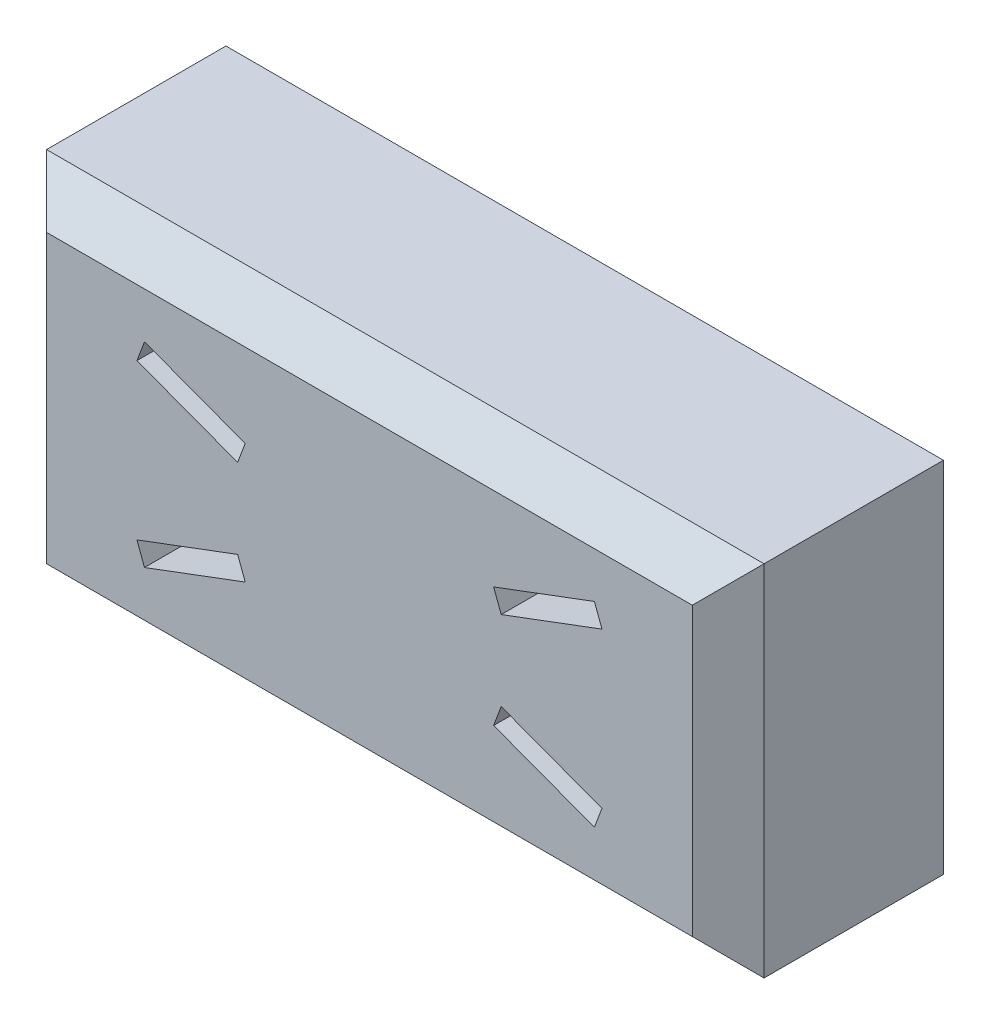
ISO-10303-21;
HEADER;
FILE_DESCRIPTION(('STEP AP214'),'2;1');
FILE_NAME('part.step','',(''),(''),'','','');
FILE_SCHEMA(('AUTOMOTIVE_DESIGN { 1 0 10303 214 1 1 1 1 }'));
ENDSEC;
DATA;
#1=APPLICATION_CONTEXT('core data for automotive mechanical design processes');
#2=APPLICATION_PROTOCOL_DEFINITION('international standard','automotive_design',2000,#1);
#3=PRODUCT_CONTEXT('',#1,'mechanical');
#4=PRODUCT('Part','Part','',(#3));
#5=PRODUCT_RELATED_PRODUCT_CATEGORY('part','',(#4));
#6=PRODUCT_DEFINITION_FORMATION('','',#4);
#7=PRODUCT_DEFINITION_CONTEXT('part definition',#1,'design');
#8=PRODUCT_DEFINITION('design','',#6,#7);
#9=PRODUCT_DEFINITION_SHAPE('','',#8);
#10=(LENGTH_UNIT() NAMED_UNIT(*) SI_UNIT(.MILLI.,.METRE.));
#11=(NAMED_UNIT(*) PLANE_ANGLE_UNIT() SI_UNIT($,.RADIAN.));
#12=(NAMED_UNIT(*) SI_UNIT($,.STERADIAN.) SOLID_ANGLE_UNIT());
#13=UNCERTAINTY_MEASURE_WITH_UNIT(LENGTH_MEASURE(1.E-05),#10,'distance_accuracy_value','');
#14=(GEOMETRIC_REPRESENTATION_CONTEXT(3) GLOBAL_UNCERTAINTY_ASSIGNED_CONTEXT((#13)) GLOBAL_UNIT_ASSIGNED_CONTEXT((#10,
#11,#12)) REPRESENTATION_CONTEXT('',''));
#15=CARTESIAN_POINT('',(0.,0.,0.));
#16=DIRECTION('',(0.,0.,1.));
#17=DIRECTION('',(1.,0.,0.));
#18=AXIS2_PLACEMENT_3D('',#15,#16,#17);
#19=CARTESIAN_POINT('',(5.,-2.5,3.));
#20=DIRECTION('',(-1.,0.,0.));
#21=DIRECTION('',(0.,0.,1.));
#22=AXIS2_PLACEMENT_3D('',#19,#20,#21);
#23=PLANE('',#22);
#24=DIRECTION('',(0.,0.,-1.));
#25=VECTOR('',#24,1.);
#26=CARTESIAN_POINT('',(5.,2.5,3.));
#27=LINE('',#26,#25);
#28=CARTESIAN_POINT('',(5.,2.5,2.5));
#29=VERTEX_POINT('',#28);
#30=CARTESIAN_POINT('',(5.,2.5,0.));
#31=VERTEX_POINT('',#30);
#32=EDGE_CURVE('E340',#29,#31,#27,.T.);
#33=ORIENTED_EDGE('',*,*,#32,.F.);
#34=DIRECTION('',(0.,-1.,0.));
#35=VECTOR('',#34,1.);
#36=CARTESIAN_POINT('',(5.,-2.5,2.5));
#37=LINE('',#36,#35);
#38=CARTESIAN_POINT('',(5.,-2.5,2.5));
#39=VERTEX_POINT('',#38);
#40=EDGE_CURVE('E11',#29,#39,#37,.T.);
#41=ORIENTED_EDGE('',*,*,#40,.T.);
#42=DIRECTION('',(0.,0.,-1.));
#43=VECTOR('',#42,1.);
#44=CARTESIAN_POINT('',(5.,-2.5,3.));
#45=LINE('',#44,#43);
#46=CARTESIAN_POINT('',(5.,-2.5,0.));
#47=VERTEX_POINT('',#46);
#48=EDGE_CURVE('E334',#39,#47,#45,.T.);
#49=ORIENTED_EDGE('',*,*,#48,.T.);
#50=DIRECTION('',(0.,1.,0.));
#51=VECTOR('',#50,1.);
#52=CARTESIAN_POINT('',(5.,-2.5,0.));
#53=LINE('',#52,#51);
#54=EDGE_CURVE('E322',#47,#31,#53,.T.);
#55=ORIENTED_EDGE('',*,*,#54,.T.);
#56=EDGE_LOOP('',(#33,#41,#49,#55));
#57=FACE_BOUND('',#56,.T.);
#58=ADVANCED_FACE('F39',(#57),#23,.F.);
#59=CARTESIAN_POINT('',(-5.,2.5,3.));
#60=DIRECTION('',(0.,-1.,0.));
#61=DIRECTION('',(0.,0.,-1.));
#62=AXIS2_PLACEMENT_3D('',#59,#60,#61);
#63=PLANE('',#62);
#64=DIRECTION('',(0.,0.,-1.));
#65=VECTOR('',#64,1.);
#66=CARTESIAN_POINT('',(-5.,2.5,3.));
#67=LINE('',#66,#65);
#68=CARTESIAN_POINT('',(-5.,2.5,2.5));
#69=VERTEX_POINT('',#68);
#70=CARTESIAN_POINT('',(-5.,2.5,0.));
#71=VERTEX_POINT('',#70);
#72=EDGE_CURVE('E338',#69,#71,#67,.T.);
#73=ORIENTED_EDGE('',*,*,#72,.F.);
#74=DIRECTION('',(1.,0.,0.));
#75=VECTOR('',#74,1.);
#76=CARTESIAN_POINT('',(-5.,2.5,2.5));
#77=LINE('',#76,#75);
#78=EDGE_CURVE('E49',#69,#29,#77,.T.);
#79=ORIENTED_EDGE('',*,*,#78,.T.);
#80=ORIENTED_EDGE('',*,*,#32,.T.);
#81=DIRECTION('',(-1.,0.,0.));
#82=VECTOR('',#81,1.);
#83=CARTESIAN_POINT('',(-5.,2.5,0.));
#84=LINE('',#83,#82);
#85=EDGE_CURVE('E325',#31,#71,#84,.T.);
#86=ORIENTED_EDGE('',*,*,#85,.T.);
#87=EDGE_LOOP('',(#73,#79,#80,#86));
#88=FACE_BOUND('',#87,.T.);
#89=ADVANCED_FACE('F378',(#88),#63,.F.);
#90=CARTESIAN_POINT('',(-5.,-2.5,3.));
#91=DIRECTION('',(1.,0.,0.));
#92=DIRECTION('',(0.,0.,-1.));
#93=AXIS2_PLACEMENT_3D('',#90,#91,#92);
#94=PLANE('',#93);
#95=DIRECTION('',(0.,0.,-1.));
#96=VECTOR('',#95,1.);
#97=CARTESIAN_POINT('',(-5.,-2.5,3.));
#98=LINE('',#97,#96);
#99=CARTESIAN_POINT('',(-5.,-2.5,2.5));
#100=VERTEX_POINT('',#99);
#101=CARTESIAN_POINT('',(-5.,-2.5,0.));
#102=VERTEX_POINT('',#101);
#103=EDGE_CURVE('E336',#100,#102,#98,.T.);
#104=ORIENTED_EDGE('',*,*,#103,.F.);
#105=DIRECTION('',(0.,1.,0.));
#106=VECTOR('',#105,1.);
#107=CARTESIAN_POINT('',(-5.,-2.5,2.5));
#108=LINE('',#107,#106);
#109=EDGE_CURVE('E354',#100,#69,#108,.T.);
#110=ORIENTED_EDGE('',*,*,#109,.T.);
#111=ORIENTED_EDGE('',*,*,#72,.T.);
#112=DIRECTION('',(0.,-1.,0.));
#113=VECTOR('',#112,1.);
#114=CARTESIAN_POINT('',(-5.,-2.5,0.));
#115=LINE('',#114,#113);
#116=EDGE_CURVE('E328',#71,#102,#115,.T.);
#117=ORIENTED_EDGE('',*,*,#116,.T.);
#118=EDGE_LOOP('',(#104,#110,#111,#117));
#119=FACE_BOUND('',#118,.T.);
#120=ADVANCED_FACE('F389',(#119),#94,.F.);
#121=CARTESIAN_POINT('',(-5.,-2.5,3.));
#122=DIRECTION('',(0.,1.,0.));
#123=DIRECTION('',(0.,0.,1.));
#124=AXIS2_PLACEMENT_3D('',#121,#122,#123);
#125=PLANE('',#124);
#126=ORIENTED_EDGE('',*,*,#48,.F.);
#127=DIRECTION('',(-1.,0.,0.));
#128=VECTOR('',#127,1.);
#129=CARTESIAN_POINT('',(-5.,-2.5,2.5));
#130=LINE('',#129,#128);
#131=EDGE_CURVE('E351',#39,#100,#130,.T.);
#132=ORIENTED_EDGE('',*,*,#131,.T.);
#133=ORIENTED_EDGE('',*,*,#103,.T.);
#134=DIRECTION('',(1.,0.,0.));
#135=VECTOR('',#134,1.);
#136=CARTESIAN_POINT('',(-5.,-2.5,0.));
#137=LINE('',#136,#135);
#138=EDGE_CURVE('E331',#102,#47,#137,.T.);
#139=ORIENTED_EDGE('',*,*,#138,.T.);
#140=EDGE_LOOP('',(#126,#132,#133,#139));
#141=FACE_BOUND('',#140,.T.);
#142=ADVANCED_FACE('F391',(#141),#125,.F.);
#143=CARTESIAN_POINT('',(0.,0.,3.));
#144=DIRECTION('',(0.,0.,-1.));
#145=DIRECTION('',(-1.,0.,0.));
#146=AXIS2_PLACEMENT_3D('',#143,#144,#145);
#147=PLANE('',#146);
#148=DIRECTION('',(0.936329177569044,-0.351123441588393,0.));
#149=VECTOR('',#148,1.);
#150=CARTESIAN_POINT('',(1.73117295913665,-0.83618753526527,3.));
#151=LINE('',#150,#149);
#152=CARTESIAN_POINT('',(1.73117295913665,-0.83618753526527,3.));
#153=VERTEX_POINT('',#152);
#154=CARTESIAN_POINT('',(3.13566672549021,-1.36287269764786,3.));
#155=VERTEX_POINT('',#154);
#156=EDGE_CURVE('E248',#153,#155,#151,.T.);
#157=ORIENTED_EDGE('',*,*,#156,.F.);
#158=DIRECTION('',(-0.351123441588394,-0.936329177569044,0.));
#159=VECTOR('',#158,1.);
#160=CARTESIAN_POINT('',(1.73117295913665,-0.83618753526527,3.));
#161=LINE('',#160,#159);
#162=CARTESIAN_POINT('',(1.83650999161316,-0.555288781994558,3.));
#163=VERTEX_POINT('',#162);
#164=EDGE_CURVE('E57',#163,#153,#161,.T.);
#165=ORIENTED_EDGE('',*,*,#164,.F.);
#166=DIRECTION('',(-0.936329177569045,0.351123441588392,0.));
#167=VECTOR('',#166,1.);
#168=CARTESIAN_POINT('',(1.83650999161316,-0.555288781994558,3.));
#169=LINE('',#168,#167);
#170=CARTESIAN_POINT('',(3.24100375796673,-1.08197394437715,3.));
#171=VERTEX_POINT('',#170);
#172=EDGE_CURVE('E241',#171,#163,#169,.T.);
#173=ORIENTED_EDGE('',*,*,#172,.F.);
#174=DIRECTION('',(0.351123441588392,0.936329177569044,0.));
#175=VECTOR('',#174,1.);
#176=CARTESIAN_POINT('',(3.24100375796673,-1.08197394437715,3.));
#177=LINE('',#176,#175);
#178=EDGE_CURVE('E244',#155,#171,#177,.T.);
#179=ORIENTED_EDGE('',*,*,#178,.F.);
#180=EDGE_LOOP('',(#157,#165,#173,#179));
#181=FACE_BOUND('',#180,.T.);
#182=DIRECTION('',(-0.936329177569044,0.351123441588393,0.));
#183=VECTOR('',#182,1.);
#184=CARTESIAN_POINT('',(-1.73117295913665,0.83618753526527,3.));
#185=LINE('',#184,#183);
#186=CARTESIAN_POINT('',(-1.73117295913665,0.83618753526527,3.));
#187=VERTEX_POINT('',#186);
#188=CARTESIAN_POINT('',(-3.13566672549021,1.36287269764786,3.));
#189=VERTEX_POINT('',#188);
#190=EDGE_CURVE('E276',#187,#189,#185,.T.);
#191=ORIENTED_EDGE('',*,*,#190,.F.);
#192=DIRECTION('',(0.351123441588394,0.936329177569044,0.));
#193=VECTOR('',#192,1.);
#194=CARTESIAN_POINT('',(-1.73117295913665,0.83618753526527,3.));
#195=LINE('',#194,#193);
#196=CARTESIAN_POINT('',(-1.83650999161316,0.555288781994558,3.));
#197=VERTEX_POINT('',#196);
#198=EDGE_CURVE('E65',#197,#187,#195,.T.);
#199=ORIENTED_EDGE('',*,*,#198,.F.);
#200=DIRECTION('',(0.936329177569045,-0.351123441588392,0.));
#201=VECTOR('',#200,1.);
#202=CARTESIAN_POINT('',(-1.83650999161316,0.555288781994558,3.));
#203=LINE('',#202,#201);
#204=CARTESIAN_POINT('',(-3.24100375796673,1.08197394437715,3.));
#205=VERTEX_POINT('',#204);
#206=EDGE_CURVE('E269',#205,#197,#203,.T.);
#207=ORIENTED_EDGE('',*,*,#206,.F.);
#208=DIRECTION('',(-0.351123441588392,-0.936329177569044,0.));
#209=VECTOR('',#208,1.);
#210=CARTESIAN_POINT('',(-3.24100375796673,1.08197394437715,3.));
#211=LINE('',#210,#209);
#212=EDGE_CURVE('E272',#189,#205,#211,.T.);
#213=ORIENTED_EDGE('',*,*,#212,.F.);
#214=EDGE_LOOP('',(#191,#199,#207,#213));
#215=FACE_BOUND('',#214,.T.);
#216=DIRECTION('',(-0.351123441588394,0.936329177569044,0.));
#217=VECTOR('',#216,1.);
#218=CARTESIAN_POINT('',(-1.73117295913665,-0.83618753526527,3.));
#219=LINE('',#218,#217);
#220=CARTESIAN_POINT('',(-1.73117295913665,-0.83618753526527,3.));
#221=VERTEX_POINT('',#220);
#222=CARTESIAN_POINT('',(-1.83650999161316,-0.555288781994558,3.));
#223=VERTEX_POINT('',#222);
#224=EDGE_CURVE('E214',#221,#223,#219,.T.);
#225=ORIENTED_EDGE('',*,*,#224,.F.);
#226=DIRECTION('',(0.936329177569044,0.351123441588393,0.));
#227=VECTOR('',#226,1.);
#228=CARTESIAN_POINT('',(-1.73117295913665,-0.83618753526527,3.));
#229=LINE('',#228,#227);
#230=CARTESIAN_POINT('',(-3.13566672549021,-1.36287269764786,3.));
#231=VERTEX_POINT('',#230);
#232=EDGE_CURVE('E193',#231,#221,#229,.T.);
#233=ORIENTED_EDGE('',*,*,#232,.F.);
#234=DIRECTION('',(0.351123441588392,-0.936329177569044,0.));
#235=VECTOR('',#234,1.);
#236=CARTESIAN_POINT('',(-3.24100375796673,-1.08197394437715,3.));
#237=LINE('',#236,#235);
#238=CARTESIAN_POINT('',(-3.24100375796673,-1.08197394437715,3.));
#239=VERTEX_POINT('',#238);
#240=EDGE_CURVE('E203',#239,#231,#237,.T.);
#241=ORIENTED_EDGE('',*,*,#240,.F.);
#242=DIRECTION('',(-0.936329177569045,-0.351123441588392,0.));
#243=VECTOR('',#242,1.);
#244=CARTESIAN_POINT('',(-1.83650999161316,-0.555288781994558,3.));
#245=LINE('',#244,#243);
#246=EDGE_CURVE('E208',#223,#239,#245,.T.);
#247=ORIENTED_EDGE('',*,*,#246,.F.);
#248=EDGE_LOOP('',(#225,#233,#241,#247));
#249=FACE_BOUND('',#248,.T.);
#250=DIRECTION('',(0.351123441588394,-0.936329177569044,0.));
#251=VECTOR('',#250,1.);
#252=CARTESIAN_POINT('',(1.73117295913665,0.83618753526527,3.));
#253=LINE('',#252,#251);
#254=CARTESIAN_POINT('',(1.73117295913665,0.83618753526527,3.));
#255=VERTEX_POINT('',#254);
#256=CARTESIAN_POINT('',(1.83650999161316,0.555288781994558,3.));
#257=VERTEX_POINT('',#256);
#258=EDGE_CURVE('E305',#255,#257,#253,.T.);
#259=ORIENTED_EDGE('',*,*,#258,.F.);
#260=DIRECTION('',(-0.936329177569044,-0.351123441588393,0.));
#261=VECTOR('',#260,1.);
#262=CARTESIAN_POINT('',(1.73117295913665,0.83618753526527,3.));
#263=LINE('',#262,#261);
#264=CARTESIAN_POINT('',(3.13566672549021,1.36287269764786,3.));
#265=VERTEX_POINT('',#264);
#266=EDGE_CURVE('E252',#265,#255,#263,.T.);
#267=ORIENTED_EDGE('',*,*,#266,.F.);
#268=DIRECTION('',(-0.351123441588392,0.936329177569044,0.));
#269=VECTOR('',#268,1.);
#270=CARTESIAN_POINT('',(3.24100375796673,1.08197394437715,3.));
#271=LINE('',#270,#269);
#272=CARTESIAN_POINT('',(3.24100375796673,1.08197394437715,3.));
#273=VERTEX_POINT('',#272);
#274=EDGE_CURVE('E294',#273,#265,#271,.T.);
#275=ORIENTED_EDGE('',*,*,#274,.F.);
#276=DIRECTION('',(0.936329177569045,0.351123441588392,0.));
#277=VECTOR('',#276,1.);
#278=CARTESIAN_POINT('',(1.83650999161316,0.555288781994558,3.));
#279=LINE('',#278,#277);
#280=EDGE_CURVE('E308',#257,#273,#279,.T.);
#281=ORIENTED_EDGE('',*,*,#280,.F.);
#282=EDGE_LOOP('',(#259,#267,#275,#281));
#283=FACE_BOUND('',#282,.T.);
#284=DIRECTION('',(0.,-1.,0.));
#285=VECTOR('',#284,1.);
#286=CARTESIAN_POINT('',(-4.5,0.,3.));
#287=LINE('',#286,#285);
#288=CARTESIAN_POINT('',(-4.5,2.,3.));
#289=VERTEX_POINT('',#288);
#290=CARTESIAN_POINT('',(-4.5,-2.,3.));
#291=VERTEX_POINT('',#290);
#292=EDGE_CURVE('E346',#289,#291,#287,.T.);
#293=ORIENTED_EDGE('',*,*,#292,.T.);
#294=DIRECTION('',(1.,0.,0.));
#295=VECTOR('',#294,1.);
#296=CARTESIAN_POINT('',(0.,-2.,3.));
#297=LINE('',#296,#295);
#298=CARTESIAN_POINT('',(4.5,-2.,3.));
#299=VERTEX_POINT('',#298);
#300=EDGE_CURVE('E348',#291,#299,#297,.T.);
#301=ORIENTED_EDGE('',*,*,#300,.T.);
#302=DIRECTION('',(0.,1.,0.));
#303=VECTOR('',#302,1.);
#304=CARTESIAN_POINT('',(4.5,0.,3.));
#305=LINE('',#304,#303);
#306=CARTESIAN_POINT('',(4.5,2.,3.));
#307=VERTEX_POINT('',#306);
#308=EDGE_CURVE('E342',#299,#307,#305,.T.);
#309=ORIENTED_EDGE('',*,*,#308,.T.);
#310=DIRECTION('',(-1.,0.,0.));
#311=VECTOR('',#310,1.);
#312=CARTESIAN_POINT('',(0.,2.,3.));
#313=LINE('',#312,#311);
#314=EDGE_CURVE('E344',#307,#289,#313,.T.);
#315=ORIENTED_EDGE('',*,*,#314,.T.);
#316=EDGE_LOOP('',(#293,#301,#309,#315));
#317=FACE_BOUND('',#316,.T.);
#318=ADVANCED_FACE('F211',(#181,#215,#249,#283,#317),#147,.F.);
#319=CARTESIAN_POINT('',(0.,0.,0.));
#320=DIRECTION('',(0.,0.,-1.));
#321=DIRECTION('',(-1.,0.,0.));
#322=AXIS2_PLACEMENT_3D('',#319,#320,#321);
#323=PLANE('',#322);
#324=ORIENTED_EDGE('',*,*,#54,.F.);
#325=ORIENTED_EDGE('',*,*,#138,.F.);
#326=ORIENTED_EDGE('',*,*,#116,.F.);
#327=ORIENTED_EDGE('',*,*,#85,.F.);
#328=EDGE_LOOP('',(#324,#325,#326,#327));
#329=FACE_BOUND('',#328,.T.);
#330=ADVANCED_FACE('F385',(#329),#323,.T.);
#331=CARTESIAN_POINT('',(0.,2.,3.));
#332=DIRECTION('',(0.,-0.707106781186549,-0.707106781186546));
#333=DIRECTION('',(-1.,0.,0.));
#334=AXIS2_PLACEMENT_3D('',#331,#332,#333);
#335=PLANE('',#334);
#336=DIRECTION('',(-0.577350269189625,-0.577350269189625,0.577350269189627));
#337=VECTOR('',#336,1.);
#338=CARTESIAN_POINT('',(3.83333333333333,1.33333333333333,3.66666666666667));
#339=LINE('',#338,#337);
#340=EDGE_CURVE('E359',#29,#307,#339,.T.);
#341=ORIENTED_EDGE('',*,*,#340,.F.);
#342=ORIENTED_EDGE('',*,*,#78,.F.);
#343=DIRECTION('',(0.577350269189625,-0.577350269189625,0.577350269189627));
#344=VECTOR('',#343,1.);
#345=CARTESIAN_POINT('',(-3.,0.500000000000002,4.5));
#346=LINE('',#345,#344);
#347=EDGE_CURVE('E44',#289,#69,#346,.F.);
#348=ORIENTED_EDGE('',*,*,#347,.F.);
#349=ORIENTED_EDGE('',*,*,#314,.F.);
#350=EDGE_LOOP('',(#341,#342,#348,#349));
#351=FACE_BOUND('',#350,.T.);
#352=ADVANCED_FACE('F42',(#351),#335,.F.);
#353=CARTESIAN_POINT('',(-4.5,0.,3.));
#354=DIRECTION('',(0.707106781186549,0.,-0.707106781186546));
#355=DIRECTION('',(0.,-1.,0.));
#356=AXIS2_PLACEMENT_3D('',#353,#354,#355);
#357=PLANE('',#356);
#358=ORIENTED_EDGE('',*,*,#347,.T.);
#359=ORIENTED_EDGE('',*,*,#109,.F.);
#360=DIRECTION('',(0.577350269189625,0.577350269189625,0.577350269189627));
#361=VECTOR('',#360,1.);
#362=CARTESIAN_POINT('',(-3.83333333333333,-1.33333333333333,3.66666666666667));
#363=LINE('',#362,#361);
#364=EDGE_CURVE('E358',#291,#100,#363,.F.);
#365=ORIENTED_EDGE('',*,*,#364,.F.);
#366=ORIENTED_EDGE('',*,*,#292,.F.);
#367=EDGE_LOOP('',(#358,#359,#365,#366));
#368=FACE_BOUND('',#367,.T.);
#369=ADVANCED_FACE('F370',(#368),#357,.F.);
#370=CARTESIAN_POINT('',(4.5,0.,3.));
#371=DIRECTION('',(-0.707106781186549,0.,-0.707106781186546));
#372=DIRECTION('',(0.,1.,0.));
#373=AXIS2_PLACEMENT_3D('',#370,#371,#372);
#374=PLANE('',#373);
#375=ORIENTED_EDGE('',*,*,#340,.T.);
#376=ORIENTED_EDGE('',*,*,#308,.F.);
#377=DIRECTION('',(0.577350269189625,-0.577350269189625,-0.577350269189627));
#378=VECTOR('',#377,1.);
#379=CARTESIAN_POINT('',(3.83333333333333,-1.33333333333333,3.66666666666667));
#380=LINE('',#379,#378);
#381=EDGE_CURVE('E315',#39,#299,#380,.F.);
#382=ORIENTED_EDGE('',*,*,#381,.F.);
#383=ORIENTED_EDGE('',*,*,#40,.F.);
#384=EDGE_LOOP('',(#375,#376,#382,#383));
#385=FACE_BOUND('',#384,.T.);
#386=ADVANCED_FACE('F397',(#385),#374,.F.);
#387=CARTESIAN_POINT('',(0.,-2.,3.));
#388=DIRECTION('',(0.,0.707106781186549,-0.707106781186546));
#389=DIRECTION('',(1.,0.,0.));
#390=AXIS2_PLACEMENT_3D('',#387,#388,#389);
#391=PLANE('',#390);
#392=ORIENTED_EDGE('',*,*,#364,.T.);
#393=ORIENTED_EDGE('',*,*,#131,.F.);
#394=ORIENTED_EDGE('',*,*,#381,.T.);
#395=ORIENTED_EDGE('',*,*,#300,.F.);
#396=EDGE_LOOP('',(#392,#393,#394,#395));
#397=FACE_BOUND('',#396,.T.);
#398=ADVANCED_FACE('F395',(#397),#391,.F.);
#399=CARTESIAN_POINT('',(1.73117295913665,0.83618753526527,2.));
#400=DIRECTION('',(-0.351123441588393,0.936329177569044,0.));
#401=DIRECTION('',(-0.936329177569044,-0.351123441588393,0.));
#402=AXIS2_PLACEMENT_3D('',#399,#400,#401);
#403=PLANE('',#402);
#404=ORIENTED_EDGE('',*,*,#266,.T.);
#405=DIRECTION('',(0.,0.,1.));
#406=VECTOR('',#405,1.);
#407=CARTESIAN_POINT('',(1.73117295913665,0.83618753526527,2.));
#408=LINE('',#407,#406);
#409=CARTESIAN_POINT('',(1.73117295913665,0.83618753526527,2.));
#410=VERTEX_POINT('',#409);
#411=EDGE_CURVE('E303',#410,#255,#408,.T.);
#412=ORIENTED_EDGE('',*,*,#411,.F.);
#413=DIRECTION('',(-0.936329177569044,-0.351123441588393,0.));
#414=VECTOR('',#413,1.);
#415=CARTESIAN_POINT('',(1.73117295913665,0.83618753526527,2.));
#416=LINE('',#415,#414);
#417=CARTESIAN_POINT('',(3.13566672549021,1.36287269764786,2.));
#418=VERTEX_POINT('',#417);
#419=EDGE_CURVE('E290',#418,#410,#416,.T.);
#420=ORIENTED_EDGE('',*,*,#419,.F.);
#421=DIRECTION('',(0.,0.,1.));
#422=VECTOR('',#421,1.);
#423=CARTESIAN_POINT('',(3.13566672549021,1.36287269764786,2.));
#424=LINE('',#423,#422);
#425=EDGE_CURVE('E313',#418,#265,#424,.T.);
#426=ORIENTED_EDGE('',*,*,#425,.T.);
#427=EDGE_LOOP('',(#404,#412,#420,#426));
#428=FACE_BOUND('',#427,.T.);
#429=ADVANCED_FACE('F425',(#428),#403,.F.);
#430=CARTESIAN_POINT('',(3.24100375796673,1.08197394437715,2.));
#431=DIRECTION('',(0.936329177569044,0.351123441588392,0.));
#432=DIRECTION('',(-0.351123441588392,0.936329177569044,0.));
#433=AXIS2_PLACEMENT_3D('',#430,#431,#432);
#434=PLANE('',#433);
#435=ORIENTED_EDGE('',*,*,#274,.T.);
#436=ORIENTED_EDGE('',*,*,#425,.F.);
#437=DIRECTION('',(-0.351123441588392,0.936329177569044,0.));
#438=VECTOR('',#437,1.);
#439=CARTESIAN_POINT('',(3.24100375796673,1.08197394437715,2.));
#440=LINE('',#439,#438);
#441=CARTESIAN_POINT('',(3.24100375796673,1.08197394437715,2.));
#442=VERTEX_POINT('',#441);
#443=EDGE_CURVE('E300',#442,#418,#440,.T.);
#444=ORIENTED_EDGE('',*,*,#443,.F.);
#445=DIRECTION('',(0.,0.,1.));
#446=VECTOR('',#445,1.);
#447=CARTESIAN_POINT('',(3.24100375796673,1.08197394437715,2.));
#448=LINE('',#447,#446);
#449=EDGE_CURVE('E316',#442,#273,#448,.T.);
#450=ORIENTED_EDGE('',*,*,#449,.T.);
#451=EDGE_LOOP('',(#435,#436,#444,#450));
#452=FACE_BOUND('',#451,.T.);
#453=ADVANCED_FACE('F490',(#452),#434,.F.);
#454=CARTESIAN_POINT('',(1.83650999161316,0.555288781994558,2.));
#455=DIRECTION('',(0.351123441588392,-0.936329177569044,0.));
#456=DIRECTION('',(0.936329177569044,0.351123441588392,0.));
#457=AXIS2_PLACEMENT_3D('',#454,#455,#456);
#458=PLANE('',#457);
#459=ORIENTED_EDGE('',*,*,#280,.T.);
#460=ORIENTED_EDGE('',*,*,#449,.F.);
#461=DIRECTION('',(0.936329177569045,0.351123441588392,0.));
#462=VECTOR('',#461,1.);
#463=CARTESIAN_POINT('',(1.83650999161316,0.555288781994558,2.));
#464=LINE('',#463,#462);
#465=CARTESIAN_POINT('',(1.83650999161316,0.555288781994558,2.));
#466=VERTEX_POINT('',#465);
#467=EDGE_CURVE('E297',#466,#442,#464,.T.);
#468=ORIENTED_EDGE('',*,*,#467,.F.);
#469=DIRECTION('',(0.,0.,1.));
#470=VECTOR('',#469,1.);
#471=CARTESIAN_POINT('',(1.83650999161316,0.555288781994558,2.));
#472=LINE('',#471,#470);
#473=EDGE_CURVE('E318',#466,#257,#472,.T.);
#474=ORIENTED_EDGE('',*,*,#473,.T.);
#475=EDGE_LOOP('',(#459,#460,#468,#474));
#476=FACE_BOUND('',#475,.T.);
#477=ADVANCED_FACE('F500',(#476),#458,.F.);
#478=CARTESIAN_POINT('',(1.73117295913665,0.83618753526527,2.));
#479=DIRECTION('',(-0.936329177569044,-0.351123441588394,0.));
#480=DIRECTION('',(0.351123441588394,-0.936329177569044,0.));
#481=AXIS2_PLACEMENT_3D('',#478,#479,#480);
#482=PLANE('',#481);
#483=ORIENTED_EDGE('',*,*,#258,.T.);
#484=ORIENTED_EDGE('',*,*,#473,.F.);
#485=DIRECTION('',(0.351123441588394,-0.936329177569044,0.));
#486=VECTOR('',#485,1.);
#487=CARTESIAN_POINT('',(1.73117295913665,0.83618753526527,2.));
#488=LINE('',#487,#486);
#489=EDGE_CURVE('E293',#410,#466,#488,.T.);
#490=ORIENTED_EDGE('',*,*,#489,.F.);
#491=ORIENTED_EDGE('',*,*,#411,.T.);
#492=EDGE_LOOP('',(#483,#484,#490,#491));
#493=FACE_BOUND('',#492,.T.);
#494=ADVANCED_FACE('F511',(#493),#482,.F.);
#495=CARTESIAN_POINT('',(0.,0.,2.));
#496=DIRECTION('',(0.,0.,1.));
#497=DIRECTION('',(1.,0.,0.));
#498=AXIS2_PLACEMENT_3D('',#495,#496,#497);
#499=PLANE('',#498);
#500=ORIENTED_EDGE('',*,*,#419,.T.);
#501=ORIENTED_EDGE('',*,*,#489,.T.);
#502=ORIENTED_EDGE('',*,*,#467,.T.);
#503=ORIENTED_EDGE('',*,*,#443,.T.);
#504=EDGE_LOOP('',(#500,#501,#502,#503));
#505=FACE_BOUND('',#504,.T.);
#506=ADVANCED_FACE('F522',(#505),#499,.T.);
#507=CARTESIAN_POINT('',(-1.73117295913665,-0.83618753526527,2.));
#508=DIRECTION('',(0.351123441588393,-0.936329177569044,0.));
#509=DIRECTION('',(0.936329177569044,0.351123441588393,0.));
#510=AXIS2_PLACEMENT_3D('',#507,#508,#509);
#511=PLANE('',#510);
#512=ORIENTED_EDGE('',*,*,#232,.T.);
#513=DIRECTION('',(0.,0.,1.));
#514=VECTOR('',#513,1.);
#515=CARTESIAN_POINT('',(-1.73117295913665,-0.83618753526527,2.));
#516=LINE('',#515,#514);
#517=CARTESIAN_POINT('',(-1.73117295913665,-0.83618753526527,2.));
#518=VERTEX_POINT('',#517);
#519=EDGE_CURVE('E225',#518,#221,#516,.T.);
#520=ORIENTED_EDGE('',*,*,#519,.F.);
#521=DIRECTION('',(0.936329177569044,0.351123441588393,0.));
#522=VECTOR('',#521,1.);
#523=CARTESIAN_POINT('',(-1.73117295913665,-0.83618753526527,2.));
#524=LINE('',#523,#522);
#525=CARTESIAN_POINT('',(-3.13566672549021,-1.36287269764786,2.));
#526=VERTEX_POINT('',#525);
#527=EDGE_CURVE('E196',#526,#518,#524,.T.);
#528=ORIENTED_EDGE('',*,*,#527,.F.);
#529=DIRECTION('',(0.,0.,1.));
#530=VECTOR('',#529,1.);
#531=CARTESIAN_POINT('',(-3.13566672549021,-1.36287269764786,2.));
#532=LINE('',#531,#530);
#533=EDGE_CURVE('E189',#526,#231,#532,.T.);
#534=ORIENTED_EDGE('',*,*,#533,.T.);
#535=EDGE_LOOP('',(#512,#520,#528,#534));
#536=FACE_BOUND('',#535,.T.);
#537=ADVANCED_FACE('F191',(#536),#511,.F.);
#538=CARTESIAN_POINT('',(-3.24100375796673,-1.08197394437715,2.));
#539=DIRECTION('',(-0.936329177569044,-0.351123441588392,0.));
#540=DIRECTION('',(0.351123441588392,-0.936329177569044,0.));
#541=AXIS2_PLACEMENT_3D('',#538,#539,#540);
#542=PLANE('',#541);
#543=ORIENTED_EDGE('',*,*,#240,.T.);
#544=ORIENTED_EDGE('',*,*,#533,.F.);
#545=DIRECTION('',(0.351123441588392,-0.936329177569044,0.));
#546=VECTOR('',#545,1.);
#547=CARTESIAN_POINT('',(-3.24100375796673,-1.08197394437715,2.));
#548=LINE('',#547,#546);
#549=CARTESIAN_POINT('',(-3.24100375796673,-1.08197394437715,2.));
#550=VERTEX_POINT('',#549);
#551=EDGE_CURVE('E222',#550,#526,#548,.T.);
#552=ORIENTED_EDGE('',*,*,#551,.F.);
#553=DIRECTION('',(0.,0.,1.));
#554=VECTOR('',#553,1.);
#555=CARTESIAN_POINT('',(-3.24100375796673,-1.08197394437715,2.));
#556=LINE('',#555,#554);
#557=EDGE_CURVE('E200',#550,#239,#556,.T.);
#558=ORIENTED_EDGE('',*,*,#557,.T.);
#559=EDGE_LOOP('',(#543,#544,#552,#558));
#560=FACE_BOUND('',#559,.T.);
#561=ADVANCED_FACE('F204',(#560),#542,.F.);
#562=CARTESIAN_POINT('',(-1.83650999161316,-0.555288781994558,2.));
#563=DIRECTION('',(-0.351123441588392,0.936329177569044,0.));
#564=DIRECTION('',(-0.936329177569044,-0.351123441588392,0.));
#565=AXIS2_PLACEMENT_3D('',#562,#563,#564);
#566=PLANE('',#565);
#567=ORIENTED_EDGE('',*,*,#246,.T.);
#568=ORIENTED_EDGE('',*,*,#557,.F.);
#569=DIRECTION('',(-0.936329177569045,-0.351123441588392,0.));
#570=VECTOR('',#569,1.);
#571=CARTESIAN_POINT('',(-1.83650999161316,-0.555288781994558,2.));
#572=LINE('',#571,#570);
#573=CARTESIAN_POINT('',(-1.83650999161316,-0.555288781994558,2.));
#574=VERTEX_POINT('',#573);
#575=EDGE_CURVE('E224',#574,#550,#572,.T.);
#576=ORIENTED_EDGE('',*,*,#575,.F.);
#577=DIRECTION('',(0.,0.,1.));
#578=VECTOR('',#577,1.);
#579=CARTESIAN_POINT('',(-1.83650999161316,-0.555288781994558,2.));
#580=LINE('',#579,#578);
#581=EDGE_CURVE('E755',#574,#223,#580,.T.);
#582=ORIENTED_EDGE('',*,*,#581,.T.);
#583=EDGE_LOOP('',(#567,#568,#576,#582));
#584=FACE_BOUND('',#583,.T.);
#585=ADVANCED_FACE('F552',(#584),#566,.F.);
#586=CARTESIAN_POINT('',(-1.73117295913665,-0.83618753526527,2.));
#587=DIRECTION('',(0.936329177569044,0.351123441588394,0.));
#588=DIRECTION('',(-0.351123441588394,0.936329177569044,0.));
#589=AXIS2_PLACEMENT_3D('',#586,#587,#588);
#590=PLANE('',#589);
#591=ORIENTED_EDGE('',*,*,#224,.T.);
#592=ORIENTED_EDGE('',*,*,#581,.F.);
#593=DIRECTION('',(-0.351123441588394,0.936329177569044,0.));
#594=VECTOR('',#593,1.);
#595=CARTESIAN_POINT('',(-1.73117295913665,-0.83618753526527,2.));
#596=LINE('',#595,#594);
#597=EDGE_CURVE('E228',#518,#574,#596,.T.);
#598=ORIENTED_EDGE('',*,*,#597,.F.);
#599=ORIENTED_EDGE('',*,*,#519,.T.);
#600=EDGE_LOOP('',(#591,#592,#598,#599));
#601=FACE_BOUND('',#600,.T.);
#602=ADVANCED_FACE('F562',(#601),#590,.F.);
#603=CARTESIAN_POINT('',(0.,0.,2.));
#604=DIRECTION('',(0.,0.,1.));
#605=DIRECTION('',(1.,0.,0.));
#606=AXIS2_PLACEMENT_3D('',#603,#604,#605);
#607=PLANE('',#606);
#608=ORIENTED_EDGE('',*,*,#527,.T.);
#609=ORIENTED_EDGE('',*,*,#597,.T.);
#610=ORIENTED_EDGE('',*,*,#575,.T.);
#611=ORIENTED_EDGE('',*,*,#551,.T.);
#612=EDGE_LOOP('',(#608,#609,#610,#611));
#613=FACE_BOUND('',#612,.T.);
#614=ADVANCED_FACE('F573',(#613),#607,.T.);
#615=CARTESIAN_POINT('',(-1.73117295913665,0.83618753526527,2.));
#616=DIRECTION('',(0.936329177569044,-0.351123441588394,0.));
#617=DIRECTION('',(0.351123441588394,0.936329177569044,0.));
#618=AXIS2_PLACEMENT_3D('',#615,#616,#617);
#619=PLANE('',#618);
#620=ORIENTED_EDGE('',*,*,#198,.T.);
#621=DIRECTION('',(0.,0.,1.));
#622=VECTOR('',#621,1.);
#623=CARTESIAN_POINT('',(-1.73117295913665,0.83618753526527,2.));
#624=LINE('',#623,#622);
#625=CARTESIAN_POINT('',(-1.73117295913665,0.83618753526527,2.));
#626=VERTEX_POINT('',#625);
#627=EDGE_CURVE('E263',#626,#187,#624,.T.);
#628=ORIENTED_EDGE('',*,*,#627,.F.);
#629=DIRECTION('',(0.351123441588394,0.936329177569044,0.));
#630=VECTOR('',#629,1.);
#631=CARTESIAN_POINT('',(-1.73117295913665,0.83618753526527,2.));
#632=LINE('',#631,#630);
#633=CARTESIAN_POINT('',(-1.83650999161316,0.555288781994558,2.));
#634=VERTEX_POINT('',#633);
#635=EDGE_CURVE('E273',#634,#626,#632,.T.);
#636=ORIENTED_EDGE('',*,*,#635,.F.);
#637=DIRECTION('',(0.,0.,1.));
#638=VECTOR('',#637,1.);
#639=CARTESIAN_POINT('',(-1.83650999161316,0.555288781994558,2.));
#640=LINE('',#639,#638);
#641=EDGE_CURVE('E215',#634,#197,#640,.T.);
#642=ORIENTED_EDGE('',*,*,#641,.T.);
#643=EDGE_LOOP('',(#620,#628,#636,#642));
#644=FACE_BOUND('',#643,.T.);
#645=ADVANCED_FACE('F584',(#644),#619,.F.);
#646=CARTESIAN_POINT('',(-1.83650999161316,0.555288781994558,2.));
#647=DIRECTION('',(-0.351123441588392,-0.936329177569044,0.));
#648=DIRECTION('',(0.936329177569044,-0.351123441588392,0.));
#649=AXIS2_PLACEMENT_3D('',#646,#647,#648);
#650=PLANE('',#649);
#651=ORIENTED_EDGE('',*,*,#206,.T.);
#652=ORIENTED_EDGE('',*,*,#641,.F.);
#653=DIRECTION('',(0.936329177569045,-0.351123441588392,0.));
#654=VECTOR('',#653,1.);
#655=CARTESIAN_POINT('',(-1.83650999161316,0.555288781994558,2.));
#656=LINE('',#655,#654);
#657=CARTESIAN_POINT('',(-3.24100375796673,1.08197394437715,2.));
#658=VERTEX_POINT('',#657);
#659=EDGE_CURVE('E265',#658,#634,#656,.T.);
#660=ORIENTED_EDGE('',*,*,#659,.F.);
#661=DIRECTION('',(0.,0.,1.));
#662=VECTOR('',#661,1.);
#663=CARTESIAN_POINT('',(-3.24100375796673,1.08197394437715,2.));
#664=LINE('',#663,#662);
#665=EDGE_CURVE('E217',#658,#205,#664,.T.);
#666=ORIENTED_EDGE('',*,*,#665,.T.);
#667=EDGE_LOOP('',(#651,#652,#660,#666));
#668=FACE_BOUND('',#667,.T.);
#669=ADVANCED_FACE('F595',(#668),#650,.F.);
#670=CARTESIAN_POINT('',(-3.24100375796673,1.08197394437715,2.));
#671=DIRECTION('',(-0.936329177569044,0.351123441588392,0.));
#672=DIRECTION('',(-0.351123441588392,-0.936329177569044,0.));
#673=AXIS2_PLACEMENT_3D('',#670,#671,#672);
#674=PLANE('',#673);
#675=ORIENTED_EDGE('',*,*,#212,.T.);
#676=ORIENTED_EDGE('',*,*,#665,.F.);
#677=DIRECTION('',(-0.351123441588392,-0.936329177569044,0.));
#678=VECTOR('',#677,1.);
#679=CARTESIAN_POINT('',(-3.24100375796673,1.08197394437715,2.));
#680=LINE('',#679,#678);
#681=CARTESIAN_POINT('',(-3.13566672549021,1.36287269764786,2.));
#682=VERTEX_POINT('',#681);
#683=EDGE_CURVE('E282',#682,#658,#680,.T.);
#684=ORIENTED_EDGE('',*,*,#683,.F.);
#685=DIRECTION('',(0.,0.,1.));
#686=VECTOR('',#685,1.);
#687=CARTESIAN_POINT('',(-3.13566672549021,1.36287269764786,2.));
#688=LINE('',#687,#686);
#689=EDGE_CURVE('E266',#682,#189,#688,.T.);
#690=ORIENTED_EDGE('',*,*,#689,.T.);
#691=EDGE_LOOP('',(#675,#676,#684,#690));
#692=FACE_BOUND('',#691,.T.);
#693=ADVANCED_FACE('F605',(#692),#674,.F.);
#694=CARTESIAN_POINT('',(-1.73117295913665,0.83618753526527,2.));
#695=DIRECTION('',(0.351123441588393,0.936329177569044,0.));
#696=DIRECTION('',(-0.936329177569044,0.351123441588393,0.));
#697=AXIS2_PLACEMENT_3D('',#694,#695,#696);
#698=PLANE('',#697);
#699=ORIENTED_EDGE('',*,*,#190,.T.);
#700=ORIENTED_EDGE('',*,*,#689,.F.);
#701=DIRECTION('',(-0.936329177569044,0.351123441588393,0.));
#702=VECTOR('',#701,1.);
#703=CARTESIAN_POINT('',(-1.73117295913665,0.83618753526527,2.));
#704=LINE('',#703,#702);
#705=EDGE_CURVE('E285',#626,#682,#704,.T.);
#706=ORIENTED_EDGE('',*,*,#705,.F.);
#707=ORIENTED_EDGE('',*,*,#627,.T.);
#708=EDGE_LOOP('',(#699,#700,#706,#707));
#709=FACE_BOUND('',#708,.T.);
#710=ADVANCED_FACE('F616',(#709),#698,.F.);
#711=CARTESIAN_POINT('',(0.,0.,2.));
#712=DIRECTION('',(0.,0.,-1.));
#713=DIRECTION('',(-1.,0.,0.));
#714=AXIS2_PLACEMENT_3D('',#711,#712,#713);
#715=PLANE('',#714);
#716=ORIENTED_EDGE('',*,*,#635,.T.);
#717=ORIENTED_EDGE('',*,*,#705,.T.);
#718=ORIENTED_EDGE('',*,*,#683,.T.);
#719=ORIENTED_EDGE('',*,*,#659,.T.);
#720=EDGE_LOOP('',(#716,#717,#718,#719));
#721=FACE_BOUND('',#720,.T.);
#722=ADVANCED_FACE('F627',(#721),#715,.F.);
#723=CARTESIAN_POINT('',(1.73117295913665,-0.83618753526527,2.));
#724=DIRECTION('',(-0.936329177569044,0.351123441588394,0.));
#725=DIRECTION('',(-0.351123441588394,-0.936329177569044,0.));
#726=AXIS2_PLACEMENT_3D('',#723,#724,#725);
#727=PLANE('',#726);
#728=ORIENTED_EDGE('',*,*,#164,.T.);
#729=DIRECTION('',(0.,0.,1.));
#730=VECTOR('',#729,1.);
#731=CARTESIAN_POINT('',(1.73117295913665,-0.83618753526527,2.));
#732=LINE('',#731,#730);
#733=CARTESIAN_POINT('',(1.73117295913665,-0.83618753526527,2.));
#734=VERTEX_POINT('',#733);
#735=EDGE_CURVE('E232',#734,#153,#732,.T.);
#736=ORIENTED_EDGE('',*,*,#735,.F.);
#737=DIRECTION('',(-0.351123441588394,-0.936329177569044,0.));
#738=VECTOR('',#737,1.);
#739=CARTESIAN_POINT('',(1.73117295913665,-0.83618753526527,2.));
#740=LINE('',#739,#738);
#741=CARTESIAN_POINT('',(1.83650999161316,-0.555288781994558,2.));
#742=VERTEX_POINT('',#741);
#743=EDGE_CURVE('E245',#742,#734,#740,.T.);
#744=ORIENTED_EDGE('',*,*,#743,.F.);
#745=DIRECTION('',(0.,0.,1.));
#746=VECTOR('',#745,1.);
#747=CARTESIAN_POINT('',(1.83650999161316,-0.555288781994558,2.));
#748=LINE('',#747,#746);
#749=EDGE_CURVE('E239',#742,#163,#748,.T.);
#750=ORIENTED_EDGE('',*,*,#749,.T.);
#751=EDGE_LOOP('',(#728,#736,#744,#750));
#752=FACE_BOUND('',#751,.T.);
#753=ADVANCED_FACE('F638',(#752),#727,.F.);
#754=CARTESIAN_POINT('',(1.83650999161316,-0.555288781994558,2.));
#755=DIRECTION('',(0.351123441588392,0.936329177569044,0.));
#756=DIRECTION('',(-0.936329177569044,0.351123441588392,0.));
#757=AXIS2_PLACEMENT_3D('',#754,#755,#756);
#758=PLANE('',#757);
#759=ORIENTED_EDGE('',*,*,#172,.T.);
#760=ORIENTED_EDGE('',*,*,#749,.F.);
#761=DIRECTION('',(-0.936329177569045,0.351123441588392,0.));
#762=VECTOR('',#761,1.);
#763=CARTESIAN_POINT('',(1.83650999161316,-0.555288781994558,2.));
#764=LINE('',#763,#762);
#765=CARTESIAN_POINT('',(3.24100375796673,-1.08197394437715,2.));
#766=VERTEX_POINT('',#765);
#767=EDGE_CURVE('E234',#766,#742,#764,.T.);
#768=ORIENTED_EDGE('',*,*,#767,.F.);
#769=DIRECTION('',(0.,0.,1.));
#770=VECTOR('',#769,1.);
#771=CARTESIAN_POINT('',(3.24100375796673,-1.08197394437715,2.));
#772=LINE('',#771,#770);
#773=EDGE_CURVE('E237',#766,#171,#772,.T.);
#774=ORIENTED_EDGE('',*,*,#773,.T.);
#775=EDGE_LOOP('',(#759,#760,#768,#774));
#776=FACE_BOUND('',#775,.T.);
#777=ADVANCED_FACE('F649',(#776),#758,.F.);
#778=CARTESIAN_POINT('',(3.24100375796673,-1.08197394437715,2.));
#779=DIRECTION('',(0.936329177569044,-0.351123441588392,0.));
#780=DIRECTION('',(0.351123441588392,0.936329177569044,0.));
#781=AXIS2_PLACEMENT_3D('',#778,#779,#780);
#782=PLANE('',#781);
#783=ORIENTED_EDGE('',*,*,#178,.T.);
#784=ORIENTED_EDGE('',*,*,#773,.F.);
#785=DIRECTION('',(0.351123441588392,0.936329177569044,0.));
#786=VECTOR('',#785,1.);
#787=CARTESIAN_POINT('',(3.24100375796673,-1.08197394437715,2.));
#788=LINE('',#787,#786);
#789=CARTESIAN_POINT('',(3.13566672549021,-1.36287269764786,2.));
#790=VERTEX_POINT('',#789);
#791=EDGE_CURVE('E255',#790,#766,#788,.T.);
#792=ORIENTED_EDGE('',*,*,#791,.F.);
#793=DIRECTION('',(0.,0.,1.));
#794=VECTOR('',#793,1.);
#795=CARTESIAN_POINT('',(3.13566672549021,-1.36287269764786,2.));
#796=LINE('',#795,#794);
#797=EDGE_CURVE('E235',#790,#155,#796,.T.);
#798=ORIENTED_EDGE('',*,*,#797,.T.);
#799=EDGE_LOOP('',(#783,#784,#792,#798));
#800=FACE_BOUND('',#799,.T.);
#801=ADVANCED_FACE('F659',(#800),#782,.F.);
#802=CARTESIAN_POINT('',(1.73117295913665,-0.83618753526527,2.));
#803=DIRECTION('',(-0.351123441588393,-0.936329177569044,0.));
#804=DIRECTION('',(0.936329177569044,-0.351123441588393,0.));
#805=AXIS2_PLACEMENT_3D('',#802,#803,#804);
#806=PLANE('',#805);
#807=ORIENTED_EDGE('',*,*,#156,.T.);
#808=ORIENTED_EDGE('',*,*,#797,.F.);
#809=DIRECTION('',(0.936329177569044,-0.351123441588393,0.));
#810=VECTOR('',#809,1.);
#811=CARTESIAN_POINT('',(1.73117295913665,-0.83618753526527,2.));
#812=LINE('',#811,#810);
#813=EDGE_CURVE('E258',#734,#790,#812,.T.);
#814=ORIENTED_EDGE('',*,*,#813,.F.);
#815=ORIENTED_EDGE('',*,*,#735,.T.);
#816=EDGE_LOOP('',(#807,#808,#814,#815));
#817=FACE_BOUND('',#816,.T.);
#818=ADVANCED_FACE('F670',(#817),#806,.F.);
#819=CARTESIAN_POINT('',(0.,0.,2.));
#820=DIRECTION('',(0.,0.,-1.));
#821=DIRECTION('',(-1.,0.,0.));
#822=AXIS2_PLACEMENT_3D('',#819,#820,#821);
#823=PLANE('',#822);
#824=ORIENTED_EDGE('',*,*,#743,.T.);
#825=ORIENTED_EDGE('',*,*,#813,.T.);
#826=ORIENTED_EDGE('',*,*,#791,.T.);
#827=ORIENTED_EDGE('',*,*,#767,.T.);
#828=EDGE_LOOP('',(#824,#825,#826,#827));
#829=FACE_BOUND('',#828,.T.);
#830=ADVANCED_FACE('F681',(#829),#823,.F.);
#831=CLOSED_SHELL('',(#58,#89,#120,#142,#318,#330,#352,#369,#386,#398,#429,#453,#477,#494,#506,
#537,#561,#585,#602,#614,#645,#669,#693,#710,#722,#753,#777,#801,#818,#830));
#832=MANIFOLD_SOLID_BREP('B2',#831);
#833=ADVANCED_BREP_SHAPE_REPRESENTATION('',(#18,#832),#14);
#834=SHAPE_DEFINITION_REPRESENTATION(#9,#833);
ENDSEC;
END-ISO-10303-21;
